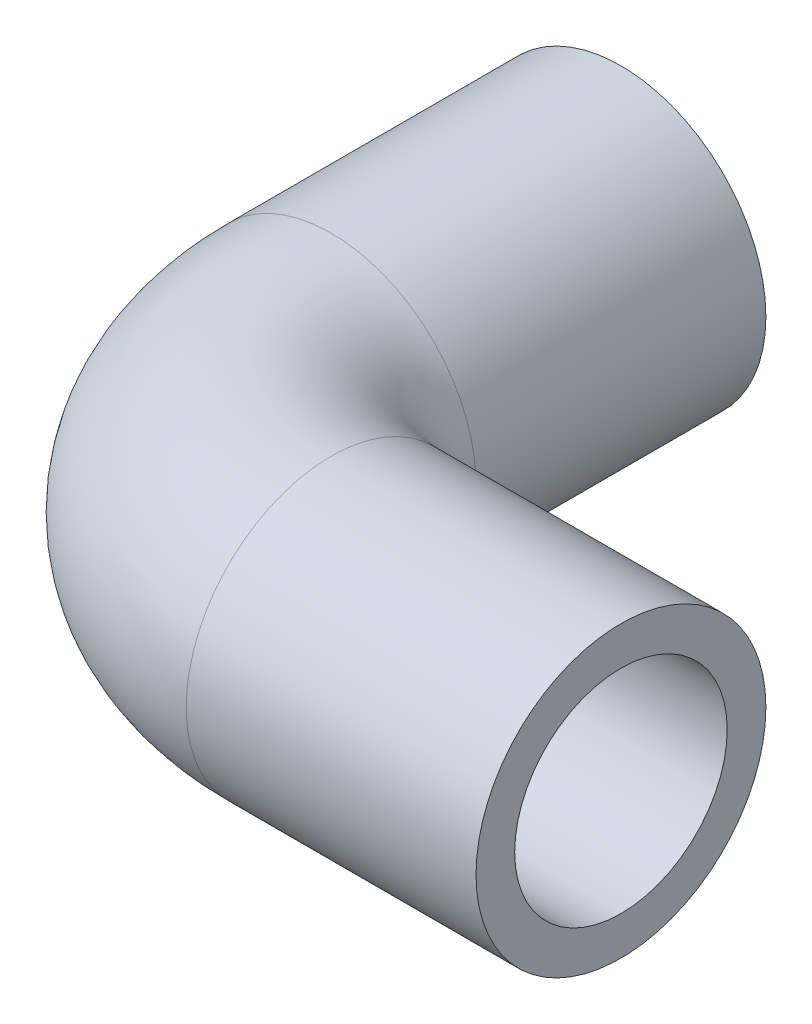
ISO-10303-21;
HEADER;
FILE_DESCRIPTION(('STEP AP214'),'2;1');
FILE_NAME('part.step','',(''),(''),'','','');
FILE_SCHEMA(('AUTOMOTIVE_DESIGN { 1 0 10303 214 1 1 1 1 }'));
ENDSEC;
DATA;
#1=APPLICATION_CONTEXT('core data for automotive mechanical design processes');
#2=APPLICATION_PROTOCOL_DEFINITION('international standard','automotive_design',2000,#1);
#3=PRODUCT_CONTEXT('',#1,'mechanical');
#4=PRODUCT('Part','Part','',(#3));
#5=PRODUCT_RELATED_PRODUCT_CATEGORY('part','',(#4));
#6=PRODUCT_DEFINITION_FORMATION('','',#4);
#7=PRODUCT_DEFINITION_CONTEXT('part definition',#1,'design');
#8=PRODUCT_DEFINITION('design','',#6,#7);
#9=PRODUCT_DEFINITION_SHAPE('','',#8);
#10=(LENGTH_UNIT() NAMED_UNIT(*) SI_UNIT(.MILLI.,.METRE.));
#11=(NAMED_UNIT(*) PLANE_ANGLE_UNIT() SI_UNIT($,.RADIAN.));
#12=(NAMED_UNIT(*) SI_UNIT($,.STERADIAN.) SOLID_ANGLE_UNIT());
#13=UNCERTAINTY_MEASURE_WITH_UNIT(LENGTH_MEASURE(1.E-05),#10,'distance_accuracy_value','');
#14=(GEOMETRIC_REPRESENTATION_CONTEXT(3) GLOBAL_UNCERTAINTY_ASSIGNED_CONTEXT((#13)) GLOBAL_UNIT_ASSIGNED_CONTEXT((#10,
#11,#12)) REPRESENTATION_CONTEXT('',''));
#15=CARTESIAN_POINT('',(0.,0.,0.));
#16=DIRECTION('',(0.,0.,1.));
#17=DIRECTION('',(1.,0.,0.));
#18=AXIS2_PLACEMENT_3D('',#15,#16,#17);
#19=CARTESIAN_POINT('',(0.,0.,0.));
#20=DIRECTION('',(1.,0.,0.));
#21=DIRECTION('',(0.,0.,-1.));
#22=AXIS2_PLACEMENT_3D('',#19,#20,#21);
#23=PLANE('',#22);
#24=CARTESIAN_POINT('',(0.,0.,0.));
#25=DIRECTION('',(1.,0.,0.));
#26=DIRECTION('',(0.,0.,-1.));
#27=AXIS2_PLACEMENT_3D('',#24,#25,#26);
#28=CIRCLE('',#27,27.5);
#29=CARTESIAN_POINT('',(0.,0.,-27.5));
#30=VERTEX_POINT('',#29);
#31=EDGE_CURVE('E80',#30,#30,#28,.T.);
#32=ORIENTED_EDGE('',*,*,#31,.F.);
#33=EDGE_LOOP('',(#32));
#34=FACE_BOUND('',#33,.T.);
#35=CARTESIAN_POINT('',(0.,0.,0.));
#36=DIRECTION('',(1.,0.,0.));
#37=DIRECTION('',(0.,0.,-1.));
#38=AXIS2_PLACEMENT_3D('',#35,#36,#37);
#39=CIRCLE('',#38,37.5);
#40=CARTESIAN_POINT('',(0.,0.,-37.5));
#41=VERTEX_POINT('',#40);
#42=EDGE_CURVE('E73',#41,#41,#39,.T.);
#43=ORIENTED_EDGE('',*,*,#42,.T.);
#44=EDGE_LOOP('',(#43));
#45=FACE_BOUND('',#44,.T.);
#46=ADVANCED_FACE('F56',(#34,#45),#23,.T.);
#47=CARTESIAN_POINT('',(-125.,0.,-125.));
#48=DIRECTION('',(0.,0.,1.));
#49=DIRECTION('',(1.,0.,0.));
#50=AXIS2_PLACEMENT_3D('',#47,#48,#49);
#51=PLANE('',#50);
#52=CARTESIAN_POINT('',(-125.,0.,-125.));
#53=DIRECTION('',(0.,0.,-1.));
#54=DIRECTION('',(-1.,0.,0.));
#55=AXIS2_PLACEMENT_3D('',#52,#53,#54);
#56=CIRCLE('',#55,27.5);
#57=CARTESIAN_POINT('',(-152.5,0.,-125.));
#58=VERTEX_POINT('',#57);
#59=EDGE_CURVE('E85',#58,#58,#56,.T.);
#60=ORIENTED_EDGE('',*,*,#59,.F.);
#61=EDGE_LOOP('',(#60));
#62=FACE_BOUND('',#61,.T.);
#63=CARTESIAN_POINT('',(-125.,0.,-125.));
#64=DIRECTION('',(0.,0.,1.));
#65=DIRECTION('',(1.,0.,0.));
#66=AXIS2_PLACEMENT_3D('',#63,#64,#65);
#67=CIRCLE('',#66,37.5);
#68=CARTESIAN_POINT('',(-87.5,0.,-125.));
#69=VERTEX_POINT('',#68);
#70=EDGE_CURVE('E11',#69,#69,#67,.T.);
#71=ORIENTED_EDGE('',*,*,#70,.F.);
#72=EDGE_LOOP('',(#71));
#73=FACE_BOUND('',#72,.T.);
#74=ADVANCED_FACE('F98',(#62,#73),#51,.F.);
#75=CARTESIAN_POINT('',(0.,0.,0.));
#76=DIRECTION('',(-1.,0.,0.));
#77=DIRECTION('',(0.,0.,1.));
#78=AXIS2_PLACEMENT_3D('',#75,#76,#77);
#79=CYLINDRICAL_SURFACE('',#78,37.5);
#80=CARTESIAN_POINT('',(-75.,0.,0.));
#81=DIRECTION('',(1.,0.,0.));
#82=DIRECTION('',(0.,0.,-1.));
#83=AXIS2_PLACEMENT_3D('',#80,#81,#82);
#84=CIRCLE('',#83,37.5);
#85=CARTESIAN_POINT('',(-75.,0.,37.5));
#86=VERTEX_POINT('',#85);
#87=EDGE_CURVE('E68',#86,#86,#84,.T.);
#88=ORIENTED_EDGE('',*,*,#87,.T.);
#89=EDGE_LOOP('',(#88));
#90=FACE_BOUND('',#89,.T.);
#91=ORIENTED_EDGE('',*,*,#42,.F.);
#92=EDGE_LOOP('',(#91));
#93=FACE_BOUND('',#92,.T.);
#94=ADVANCED_FACE('F101',(#90,#93),#79,.T.);
#95=CARTESIAN_POINT('',(-75.,0.,-50.));
#96=DIRECTION('',(0.,-1.,0.));
#97=DIRECTION('',(0.,0.,-1.));
#98=AXIS2_PLACEMENT_3D('',#95,#96,#97);
#99=TOROIDAL_SURFACE('',#98,50.,37.5);
#100=CARTESIAN_POINT('',(-125.,0.,-50.));
#101=DIRECTION('',(0.,0.,1.));
#102=DIRECTION('',(1.,0.,0.));
#103=AXIS2_PLACEMENT_3D('',#100,#101,#102);
#104=CIRCLE('',#103,37.5);
#105=CARTESIAN_POINT('',(-162.5,0.,-50.));
#106=VERTEX_POINT('',#105);
#107=EDGE_CURVE('E63',#106,#106,#104,.T.);
#108=CARTESIAN_POINT('',(-75.,0.,-50.));
#109=DIRECTION('',(0.,-1.,0.));
#110=DIRECTION('',(0.,0.,-1.));
#111=AXIS2_PLACEMENT_3D('',#108,#109,#110);
#112=CIRCLE('',#111,87.5);
#113=EDGE_CURVE('',#86,#106,#112,.T.);
#114=ORIENTED_EDGE('',*,*,#87,.F.);
#115=ORIENTED_EDGE('',*,*,#107,.T.);
#116=ORIENTED_EDGE('',*,*,#113,.T.);
#117=ORIENTED_EDGE('',*,*,#113,.F.);
#118=EDGE_LOOP('',(#114,#116,#115,#117));
#119=FACE_BOUND('',#118,.T.);
#120=ADVANCED_FACE('F105',(#119),#99,.T.);
#121=CARTESIAN_POINT('',(-125.,0.,-50.));
#122=DIRECTION('',(0.,0.,-1.));
#123=DIRECTION('',(-1.,0.,0.));
#124=AXIS2_PLACEMENT_3D('',#121,#122,#123);
#125=CYLINDRICAL_SURFACE('',#124,37.5);
#126=ORIENTED_EDGE('',*,*,#70,.T.);
#127=EDGE_LOOP('',(#126));
#128=FACE_BOUND('',#127,.T.);
#129=ORIENTED_EDGE('',*,*,#107,.F.);
#130=EDGE_LOOP('',(#129));
#131=FACE_BOUND('',#130,.T.);
#132=ADVANCED_FACE('F110',(#128,#131),#125,.T.);
#133=CARTESIAN_POINT('',(0.,0.,0.));
#134=DIRECTION('',(-1.,0.,0.));
#135=DIRECTION('',(0.,0.,1.));
#136=AXIS2_PLACEMENT_3D('',#133,#134,#135);
#137=CYLINDRICAL_SURFACE('',#136,27.5);
#138=CARTESIAN_POINT('',(-75.,0.,0.));
#139=DIRECTION('',(-1.,0.,0.));
#140=DIRECTION('',(0.,0.,1.));
#141=AXIS2_PLACEMENT_3D('',#138,#139,#140);
#142=CIRCLE('',#141,27.5);
#143=CARTESIAN_POINT('',(-75.,0.,27.5));
#144=VERTEX_POINT('',#143);
#145=EDGE_CURVE('E84',#144,#144,#142,.F.);
#146=ORIENTED_EDGE('',*,*,#145,.F.);
#147=EDGE_LOOP('',(#146));
#148=FACE_BOUND('',#147,.T.);
#149=ORIENTED_EDGE('',*,*,#31,.T.);
#150=EDGE_LOOP('',(#149));
#151=FACE_BOUND('',#150,.T.);
#152=ADVANCED_FACE('F112',(#148,#151),#137,.F.);
#153=CARTESIAN_POINT('',(-75.,0.,-50.));
#154=DIRECTION('',(0.,-1.,0.));
#155=DIRECTION('',(0.,0.,-1.));
#156=AXIS2_PLACEMENT_3D('',#153,#154,#155);
#157=TOROIDAL_SURFACE('',#156,50.,27.5);
#158=CARTESIAN_POINT('',(-125.,0.,-50.));
#159=DIRECTION('',(0.,0.,1.));
#160=DIRECTION('',(1.,0.,0.));
#161=AXIS2_PLACEMENT_3D('',#158,#159,#160);
#162=CIRCLE('',#161,27.5);
#163=CARTESIAN_POINT('',(-152.5,0.,-50.));
#164=VERTEX_POINT('',#163);
#165=EDGE_CURVE('E79',#164,#164,#162,.T.);
#166=CARTESIAN_POINT('',(-75.,0.,-50.));
#167=DIRECTION('',(0.,-1.,0.));
#168=DIRECTION('',(0.,0.,-1.));
#169=AXIS2_PLACEMENT_3D('',#166,#167,#168);
#170=CIRCLE('',#169,77.5);
#171=EDGE_CURVE('',#144,#164,#170,.T.);
#172=ORIENTED_EDGE('',*,*,#145,.T.);
#173=ORIENTED_EDGE('',*,*,#165,.F.);
#174=ORIENTED_EDGE('',*,*,#171,.T.);
#175=ORIENTED_EDGE('',*,*,#171,.F.);
#176=EDGE_LOOP('',(#172,#174,#173,#175));
#177=FACE_BOUND('',#176,.T.);
#178=ADVANCED_FACE('F115',(#177),#157,.F.);
#179=CARTESIAN_POINT('',(-125.,0.,-50.));
#180=DIRECTION('',(0.,0.,-1.));
#181=DIRECTION('',(-1.,0.,0.));
#182=AXIS2_PLACEMENT_3D('',#179,#180,#181);
#183=CYLINDRICAL_SURFACE('',#182,27.5);
#184=ORIENTED_EDGE('',*,*,#165,.T.);
#185=EDGE_LOOP('',(#184));
#186=FACE_BOUND('',#185,.T.);
#187=ORIENTED_EDGE('',*,*,#59,.T.);
#188=EDGE_LOOP('',(#187));
#189=FACE_BOUND('',#188,.T.);
#190=ADVANCED_FACE('F96',(#186,#189),#183,.F.);
#191=CLOSED_SHELL('',(#46,#74,#94,#120,#132,#152,#178,#190));
#192=MANIFOLD_SOLID_BREP('B2',#191);
#193=ADVANCED_BREP_SHAPE_REPRESENTATION('',(#18,#192),#14);
#194=SHAPE_DEFINITION_REPRESENTATION(#9,#193);
ENDSEC;
END-ISO-10303-21;
